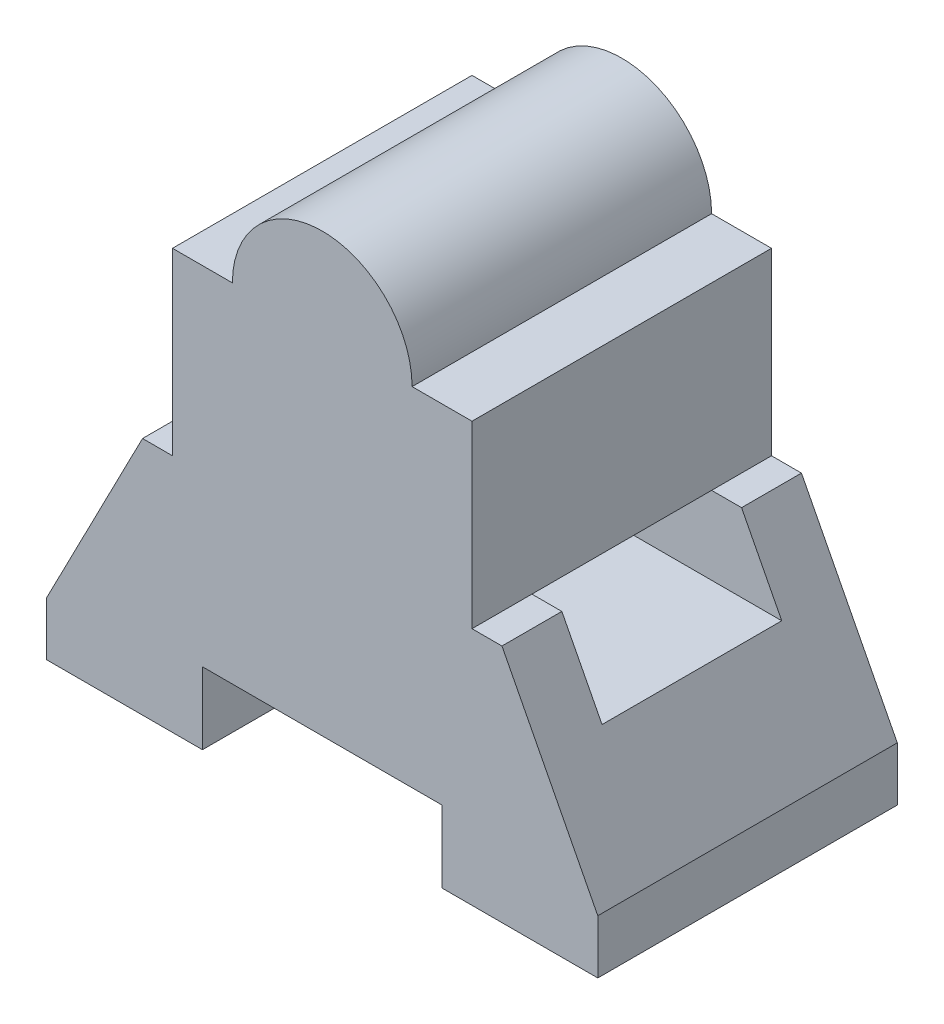
ISO-10303-21;
HEADER;
FILE_DESCRIPTION(('STEP AP214'),'2;1');
FILE_NAME('part.step','',(''),(''),'','','');
FILE_SCHEMA(('AUTOMOTIVE_DESIGN { 1 0 10303 214 1 1 1 1 }'));
ENDSEC;
DATA;
#1=APPLICATION_CONTEXT('core data for automotive mechanical design processes');
#2=APPLICATION_PROTOCOL_DEFINITION('international standard','automotive_design',2000,#1);
#3=PRODUCT_CONTEXT('',#1,'mechanical');
#4=PRODUCT('Part','Part','',(#3));
#5=PRODUCT_RELATED_PRODUCT_CATEGORY('part','',(#4));
#6=PRODUCT_DEFINITION_FORMATION('','',#4);
#7=PRODUCT_DEFINITION_CONTEXT('part definition',#1,'design');
#8=PRODUCT_DEFINITION('design','',#6,#7);
#9=PRODUCT_DEFINITION_SHAPE('','',#8);
#10=(LENGTH_UNIT() NAMED_UNIT(*) SI_UNIT(.MILLI.,.METRE.));
#11=(NAMED_UNIT(*) PLANE_ANGLE_UNIT() SI_UNIT($,.RADIAN.));
#12=(NAMED_UNIT(*) SI_UNIT($,.STERADIAN.) SOLID_ANGLE_UNIT());
#13=UNCERTAINTY_MEASURE_WITH_UNIT(LENGTH_MEASURE(1.E-05),#10,'distance_accuracy_value','');
#14=(GEOMETRIC_REPRESENTATION_CONTEXT(3) GLOBAL_UNCERTAINTY_ASSIGNED_CONTEXT((#13)) GLOBAL_UNIT_ASSIGNED_CONTEXT((#10,
#11,#12)) REPRESENTATION_CONTEXT('',''));
#15=CARTESIAN_POINT('',(0.,0.,0.));
#16=DIRECTION('',(0.,0.,1.));
#17=DIRECTION('',(1.,0.,0.));
#18=AXIS2_PLACEMENT_3D('',#15,#16,#17);
#19=CARTESIAN_POINT('',(21.,40.,50.));
#20=DIRECTION('',(0.,-1.,0.));
#21=DIRECTION('',(0.,0.,-1.));
#22=AXIS2_PLACEMENT_3D('',#19,#20,#21);
#23=PLANE('',#22);
#24=DIRECTION('',(0.,0.,-1.));
#25=VECTOR('',#24,1.);
#26=CARTESIAN_POINT('',(21.,40.,50.));
#27=LINE('',#26,#25);
#28=CARTESIAN_POINT('',(21.,40.,50.));
#29=VERTEX_POINT('',#28);
#30=CARTESIAN_POINT('',(21.,40.,40.));
#31=VERTEX_POINT('',#30);
#32=EDGE_CURVE('E270',#29,#31,#27,.T.);
#33=ORIENTED_EDGE('',*,*,#32,.T.);
#34=DIRECTION('',(-1.,0.,0.));
#35=VECTOR('',#34,1.);
#36=CARTESIAN_POINT('',(92.,40.,40.));
#37=LINE('',#36,#35);
#38=CARTESIAN_POINT('',(16.,40.,40.));
#39=VERTEX_POINT('',#38);
#40=EDGE_CURVE('E209',#31,#39,#37,.T.);
#41=ORIENTED_EDGE('',*,*,#40,.T.);
#42=DIRECTION('',(0.,0.,-1.));
#43=VECTOR('',#42,1.);
#44=CARTESIAN_POINT('',(16.,40.,50.));
#45=LINE('',#44,#43);
#46=CARTESIAN_POINT('',(16.,40.,50.));
#47=VERTEX_POINT('',#46);
#48=EDGE_CURVE('E265',#47,#39,#45,.T.);
#49=ORIENTED_EDGE('',*,*,#48,.F.);
#50=DIRECTION('',(-1.,0.,0.));
#51=VECTOR('',#50,1.);
#52=CARTESIAN_POINT('',(21.,40.,50.));
#53=LINE('',#52,#51);
#54=EDGE_CURVE('E417',#29,#47,#53,.T.);
#55=ORIENTED_EDGE('',*,*,#54,.F.);
#56=EDGE_LOOP('',(#33,#41,#49,#55));
#57=FACE_BOUND('',#56,.T.);
#58=ADVANCED_FACE('F44',(#57),#23,.F.);
#59=CARTESIAN_POINT('',(76.,40.,50.));
#60=DIRECTION('',(0.,-1.,0.));
#61=DIRECTION('',(0.,0.,-1.));
#62=AXIS2_PLACEMENT_3D('',#59,#60,#61);
#63=PLANE('',#62);
#64=DIRECTION('',(0.,0.,-1.));
#65=VECTOR('',#64,1.);
#66=CARTESIAN_POINT('',(76.,40.,50.));
#67=LINE('',#66,#65);
#68=CARTESIAN_POINT('',(76.,40.,50.));
#69=VERTEX_POINT('',#68);
#70=CARTESIAN_POINT('',(76.,40.,40.));
#71=VERTEX_POINT('',#70);
#72=EDGE_CURVE('E214',#69,#71,#67,.T.);
#73=ORIENTED_EDGE('',*,*,#72,.T.);
#74=CARTESIAN_POINT('',(71.,40.,40.));
#75=VERTEX_POINT('',#74);
#76=EDGE_CURVE('E194',#71,#75,#37,.T.);
#77=ORIENTED_EDGE('',*,*,#76,.T.);
#78=DIRECTION('',(0.,0.,-1.));
#79=VECTOR('',#78,1.);
#80=CARTESIAN_POINT('',(71.,40.,50.));
#81=LINE('',#80,#79);
#82=CARTESIAN_POINT('',(71.,40.,50.));
#83=VERTEX_POINT('',#82);
#84=EDGE_CURVE('E233',#83,#75,#81,.T.);
#85=ORIENTED_EDGE('',*,*,#84,.F.);
#86=DIRECTION('',(-1.,0.,0.));
#87=VECTOR('',#86,1.);
#88=CARTESIAN_POINT('',(76.,40.,50.));
#89=LINE('',#88,#87);
#90=EDGE_CURVE('E222',#69,#83,#89,.T.);
#91=ORIENTED_EDGE('',*,*,#90,.F.);
#92=EDGE_LOOP('',(#73,#77,#85,#91));
#93=FACE_BOUND('',#92,.T.);
#94=ADVANCED_FACE('F221',(#93),#63,.F.);
#95=CARTESIAN_POINT('',(31.,70.,50.));
#96=DIRECTION('',(0.,-1.,0.));
#97=DIRECTION('',(0.,0.,-1.));
#98=AXIS2_PLACEMENT_3D('',#95,#96,#97);
#99=PLANE('',#98);
#100=DIRECTION('',(-1.,0.,0.));
#101=VECTOR('',#100,1.);
#102=CARTESIAN_POINT('',(31.,70.,0.));
#103=LINE('',#102,#101);
#104=CARTESIAN_POINT('',(31.,70.,0.));
#105=VERTEX_POINT('',#104);
#106=CARTESIAN_POINT('',(21.,70.,0.));
#107=VERTEX_POINT('',#106);
#108=EDGE_CURVE('E291',#105,#107,#103,.T.);
#109=ORIENTED_EDGE('',*,*,#108,.T.);
#110=DIRECTION('',(0.,0.,-1.));
#111=VECTOR('',#110,1.);
#112=CARTESIAN_POINT('',(21.,70.,50.));
#113=LINE('',#112,#111);
#114=CARTESIAN_POINT('',(21.,70.,50.));
#115=VERTEX_POINT('',#114);
#116=EDGE_CURVE('E53',#115,#107,#113,.T.);
#117=ORIENTED_EDGE('',*,*,#116,.F.);
#118=DIRECTION('',(-1.,0.,0.));
#119=VECTOR('',#118,1.);
#120=CARTESIAN_POINT('',(31.,70.,50.));
#121=LINE('',#120,#119);
#122=CARTESIAN_POINT('',(31.,70.,50.));
#123=VERTEX_POINT('',#122);
#124=EDGE_CURVE('E354',#123,#115,#121,.T.);
#125=ORIENTED_EDGE('',*,*,#124,.F.);
#126=DIRECTION('',(0.,0.,-1.));
#127=VECTOR('',#126,1.);
#128=CARTESIAN_POINT('',(31.,70.,50.));
#129=LINE('',#128,#127);
#130=EDGE_CURVE('E293',#123,#105,#129,.T.);
#131=ORIENTED_EDGE('',*,*,#130,.T.);
#132=EDGE_LOOP('',(#109,#117,#125,#131));
#133=FACE_BOUND('',#132,.T.);
#134=ADVANCED_FACE('F46',(#133),#99,.F.);
#135=CARTESIAN_POINT('',(21.,70.,50.));
#136=DIRECTION('',(1.,0.,0.));
#137=DIRECTION('',(0.,1.,0.));
#138=AXIS2_PLACEMENT_3D('',#135,#136,#137);
#139=PLANE('',#138);
#140=DIRECTION('',(0.,-1.,0.));
#141=VECTOR('',#140,1.);
#142=CARTESIAN_POINT('',(21.,70.,0.));
#143=LINE('',#142,#141);
#144=CARTESIAN_POINT('',(21.,40.,0.));
#145=VERTEX_POINT('',#144);
#146=EDGE_CURVE('E282',#107,#145,#143,.T.);
#147=ORIENTED_EDGE('',*,*,#146,.T.);
#148=CARTESIAN_POINT('',(21.,40.,10.));
#149=VERTEX_POINT('',#148);
#150=EDGE_CURVE('E269',#149,#145,#27,.T.);
#151=ORIENTED_EDGE('',*,*,#150,.F.);
#152=DIRECTION('',(0.,0.,1.));
#153=VECTOR('',#152,1.);
#154=CARTESIAN_POINT('',(21.,40.,50.));
#155=LINE('',#154,#153);
#156=EDGE_CURVE('E207',#149,#31,#155,.T.);
#157=ORIENTED_EDGE('',*,*,#156,.T.);
#158=ORIENTED_EDGE('',*,*,#32,.F.);
#159=DIRECTION('',(0.,-1.,0.));
#160=VECTOR('',#159,1.);
#161=CARTESIAN_POINT('',(21.,70.,50.));
#162=LINE('',#161,#160);
#163=EDGE_CURVE('E285',#115,#29,#162,.T.);
#164=ORIENTED_EDGE('',*,*,#163,.F.);
#165=ORIENTED_EDGE('',*,*,#116,.T.);
#166=EDGE_LOOP('',(#147,#151,#157,#158,#164,#165));
#167=FACE_BOUND('',#166,.T.);
#168=ADVANCED_FACE('F280',(#167),#139,.F.);
#169=CARTESIAN_POINT('',(16.,40.,10.));
#170=VERTEX_POINT('',#169);
#171=CARTESIAN_POINT('',(16.,40.,0.));
#172=VERTEX_POINT('',#171);
#173=EDGE_CURVE('E264',#170,#172,#45,.T.);
#174=ORIENTED_EDGE('',*,*,#173,.F.);
#175=DIRECTION('',(-1.,0.,0.));
#176=VECTOR('',#175,1.);
#177=CARTESIAN_POINT('',(92.,40.,10.));
#178=LINE('',#177,#176);
#179=EDGE_CURVE('E60',#149,#170,#178,.T.);
#180=ORIENTED_EDGE('',*,*,#179,.F.);
#181=ORIENTED_EDGE('',*,*,#150,.T.);
#182=DIRECTION('',(-1.,0.,0.));
#183=VECTOR('',#182,1.);
#184=CARTESIAN_POINT('',(21.,40.,0.));
#185=LINE('',#184,#183);
#186=EDGE_CURVE('E302',#145,#172,#185,.T.);
#187=ORIENTED_EDGE('',*,*,#186,.T.);
#188=EDGE_LOOP('',(#174,#180,#181,#187));
#189=FACE_BOUND('',#188,.T.);
#190=ADVANCED_FACE('F583',(#189),#23,.F.);
#191=CARTESIAN_POINT('',(16.,40.,50.));
#192=DIRECTION('',(0.888620657054864,-0.458642919770252,0.));
#193=DIRECTION('',(0.458642919770252,0.888620657054864,0.));
#194=AXIS2_PLACEMENT_3D('',#191,#192,#193);
#195=PLANE('',#194);
#196=ORIENTED_EDGE('',*,*,#48,.T.);
#197=DIRECTION('',(-0.458642919770252,-0.888620657054864,0.));
#198=VECTOR('',#197,1.);
#199=CARTESIAN_POINT('',(16.,40.,40.));
#200=LINE('',#199,#198);
#201=CARTESIAN_POINT('',(9.29032258064516,27.,40.));
#202=VERTEX_POINT('',#201);
#203=EDGE_CURVE('E218',#39,#202,#200,.T.);
#204=ORIENTED_EDGE('',*,*,#203,.T.);
#205=DIRECTION('',(0.,0.,-1.));
#206=VECTOR('',#205,1.);
#207=CARTESIAN_POINT('',(9.29032258064515,27.,50.));
#208=LINE('',#207,#206);
#209=CARTESIAN_POINT('',(9.29032258064516,27.,10.));
#210=VERTEX_POINT('',#209);
#211=EDGE_CURVE('E297',#202,#210,#208,.T.);
#212=ORIENTED_EDGE('',*,*,#211,.T.);
#213=DIRECTION('',(0.458642919770252,0.888620657054864,0.));
#214=VECTOR('',#213,1.);
#215=CARTESIAN_POINT('',(16.,40.,10.));
#216=LINE('',#215,#214);
#217=EDGE_CURVE('E219',#210,#170,#216,.T.);
#218=ORIENTED_EDGE('',*,*,#217,.T.);
#219=ORIENTED_EDGE('',*,*,#173,.T.);
#220=DIRECTION('',(-0.458642919770252,-0.888620657054864,0.));
#221=VECTOR('',#220,1.);
#222=CARTESIAN_POINT('',(16.,40.,0.));
#223=LINE('',#222,#221);
#224=CARTESIAN_POINT('',(0.,9.,0.));
#225=VERTEX_POINT('',#224);
#226=EDGE_CURVE('E313',#172,#225,#223,.T.);
#227=ORIENTED_EDGE('',*,*,#226,.T.);
#228=DIRECTION('',(0.,0.,-1.));
#229=VECTOR('',#228,1.);
#230=CARTESIAN_POINT('',(0.,9.,50.));
#231=LINE('',#230,#229);
#232=CARTESIAN_POINT('',(0.,9.,50.));
#233=VERTEX_POINT('',#232);
#234=EDGE_CURVE('E260',#233,#225,#231,.T.);
#235=ORIENTED_EDGE('',*,*,#234,.F.);
#236=DIRECTION('',(-0.458642919770252,-0.888620657054864,0.));
#237=VECTOR('',#236,1.);
#238=CARTESIAN_POINT('',(16.,40.,50.));
#239=LINE('',#238,#237);
#240=EDGE_CURVE('E414',#47,#233,#239,.T.);
#241=ORIENTED_EDGE('',*,*,#240,.F.);
#242=EDGE_LOOP('',(#196,#204,#212,#218,#219,#227,#235,#241));
#243=FACE_BOUND('',#242,.T.);
#244=ADVANCED_FACE('F617',(#243),#195,.F.);
#245=CARTESIAN_POINT('',(0.,9.,50.));
#246=DIRECTION('',(1.,0.,0.));
#247=DIRECTION('',(0.,1.,0.));
#248=AXIS2_PLACEMENT_3D('',#245,#246,#247);
#249=PLANE('',#248);
#250=DIRECTION('',(0.,-1.,0.));
#251=VECTOR('',#250,1.);
#252=CARTESIAN_POINT('',(0.,9.,0.));
#253=LINE('',#252,#251);
#254=CARTESIAN_POINT('',(0.,0.,0.));
#255=VERTEX_POINT('',#254);
#256=EDGE_CURVE('E316',#225,#255,#253,.T.);
#257=ORIENTED_EDGE('',*,*,#256,.T.);
#258=DIRECTION('',(0.,0.,-1.));
#259=VECTOR('',#258,1.);
#260=CARTESIAN_POINT('',(0.,0.,50.));
#261=LINE('',#260,#259);
#262=CARTESIAN_POINT('',(0.,0.,50.));
#263=VERTEX_POINT('',#262);
#264=EDGE_CURVE('E256',#263,#255,#261,.T.);
#265=ORIENTED_EDGE('',*,*,#264,.F.);
#266=DIRECTION('',(0.,-1.,0.));
#267=VECTOR('',#266,1.);
#268=CARTESIAN_POINT('',(0.,9.,50.));
#269=LINE('',#268,#267);
#270=EDGE_CURVE('E411',#233,#263,#269,.T.);
#271=ORIENTED_EDGE('',*,*,#270,.F.);
#272=ORIENTED_EDGE('',*,*,#234,.T.);
#273=EDGE_LOOP('',(#257,#265,#271,#272));
#274=FACE_BOUND('',#273,.T.);
#275=ADVANCED_FACE('F622',(#274),#249,.F.);
#276=CARTESIAN_POINT('',(0.,0.,50.));
#277=DIRECTION('',(0.,1.,0.));
#278=DIRECTION('',(0.,0.,1.));
#279=AXIS2_PLACEMENT_3D('',#276,#277,#278);
#280=PLANE('',#279);
#281=DIRECTION('',(1.,0.,0.));
#282=VECTOR('',#281,1.);
#283=CARTESIAN_POINT('',(0.,0.,0.));
#284=LINE('',#283,#282);
#285=CARTESIAN_POINT('',(26.,0.,0.));
#286=VERTEX_POINT('',#285);
#287=EDGE_CURVE('E319',#255,#286,#284,.T.);
#288=ORIENTED_EDGE('',*,*,#287,.T.);
#289=DIRECTION('',(0.,0.,-1.));
#290=VECTOR('',#289,1.);
#291=CARTESIAN_POINT('',(26.,0.,50.));
#292=LINE('',#291,#290);
#293=CARTESIAN_POINT('',(26.,0.,50.));
#294=VERTEX_POINT('',#293);
#295=EDGE_CURVE('E252',#294,#286,#292,.T.);
#296=ORIENTED_EDGE('',*,*,#295,.F.);
#297=DIRECTION('',(1.,0.,0.));
#298=VECTOR('',#297,1.);
#299=CARTESIAN_POINT('',(0.,0.,50.));
#300=LINE('',#299,#298);
#301=EDGE_CURVE('E408',#263,#294,#300,.T.);
#302=ORIENTED_EDGE('',*,*,#301,.F.);
#303=ORIENTED_EDGE('',*,*,#264,.T.);
#304=EDGE_LOOP('',(#288,#296,#302,#303));
#305=FACE_BOUND('',#304,.T.);
#306=ADVANCED_FACE('F818',(#305),#280,.F.);
#307=CARTESIAN_POINT('',(26.,0.,50.));
#308=DIRECTION('',(-1.,0.,0.));
#309=DIRECTION('',(0.,0.,1.));
#310=AXIS2_PLACEMENT_3D('',#307,#308,#309);
#311=PLANE('',#310);
#312=DIRECTION('',(0.,1.,0.));
#313=VECTOR('',#312,1.);
#314=CARTESIAN_POINT('',(26.,0.,0.));
#315=LINE('',#314,#313);
#316=CARTESIAN_POINT('',(26.,12.,0.));
#317=VERTEX_POINT('',#316);
#318=EDGE_CURVE('E322',#286,#317,#315,.T.);
#319=ORIENTED_EDGE('',*,*,#318,.T.);
#320=DIRECTION('',(0.,0.,-1.));
#321=VECTOR('',#320,1.);
#322=CARTESIAN_POINT('',(26.,12.,50.));
#323=LINE('',#322,#321);
#324=CARTESIAN_POINT('',(26.,12.,50.));
#325=VERTEX_POINT('',#324);
#326=EDGE_CURVE('E248',#325,#317,#323,.T.);
#327=ORIENTED_EDGE('',*,*,#326,.F.);
#328=DIRECTION('',(0.,1.,0.));
#329=VECTOR('',#328,1.);
#330=CARTESIAN_POINT('',(26.,0.,50.));
#331=LINE('',#330,#329);
#332=EDGE_CURVE('E405',#294,#325,#331,.T.);
#333=ORIENTED_EDGE('',*,*,#332,.F.);
#334=ORIENTED_EDGE('',*,*,#295,.T.);
#335=EDGE_LOOP('',(#319,#327,#333,#334));
#336=FACE_BOUND('',#335,.T.);
#337=ADVANCED_FACE('F807',(#336),#311,.F.);
#338=CARTESIAN_POINT('',(26.,12.,50.));
#339=DIRECTION('',(0.,1.,0.));
#340=DIRECTION('',(0.,0.,1.));
#341=AXIS2_PLACEMENT_3D('',#338,#339,#340);
#342=PLANE('',#341);
#343=DIRECTION('',(1.,0.,0.));
#344=VECTOR('',#343,1.);
#345=CARTESIAN_POINT('',(26.,12.,0.));
#346=LINE('',#345,#344);
#347=CARTESIAN_POINT('',(66.,12.,0.));
#348=VERTEX_POINT('',#347);
#349=EDGE_CURVE('E325',#317,#348,#346,.T.);
#350=ORIENTED_EDGE('',*,*,#349,.T.);
#351=DIRECTION('',(0.,0.,-1.));
#352=VECTOR('',#351,1.);
#353=CARTESIAN_POINT('',(66.,12.,50.));
#354=LINE('',#353,#352);
#355=CARTESIAN_POINT('',(66.,12.,50.));
#356=VERTEX_POINT('',#355);
#357=EDGE_CURVE('E244',#356,#348,#354,.T.);
#358=ORIENTED_EDGE('',*,*,#357,.F.);
#359=DIRECTION('',(1.,0.,0.));
#360=VECTOR('',#359,1.);
#361=CARTESIAN_POINT('',(26.,12.,50.));
#362=LINE('',#361,#360);
#363=EDGE_CURVE('E402',#325,#356,#362,.T.);
#364=ORIENTED_EDGE('',*,*,#363,.F.);
#365=ORIENTED_EDGE('',*,*,#326,.T.);
#366=EDGE_LOOP('',(#350,#358,#364,#365));
#367=FACE_BOUND('',#366,.T.);
#368=ADVANCED_FACE('F796',(#367),#342,.F.);
#369=CARTESIAN_POINT('',(66.,12.,50.));
#370=DIRECTION('',(1.,0.,0.));
#371=DIRECTION('',(0.,0.,-1.));
#372=AXIS2_PLACEMENT_3D('',#369,#370,#371);
#373=PLANE('',#372);
#374=DIRECTION('',(0.,-1.,0.));
#375=VECTOR('',#374,1.);
#376=CARTESIAN_POINT('',(66.,12.,0.));
#377=LINE('',#376,#375);
#378=CARTESIAN_POINT('',(66.,0.,0.));
#379=VERTEX_POINT('',#378);
#380=EDGE_CURVE('E328',#348,#379,#377,.T.);
#381=ORIENTED_EDGE('',*,*,#380,.T.);
#382=DIRECTION('',(0.,0.,-1.));
#383=VECTOR('',#382,1.);
#384=CARTESIAN_POINT('',(66.,0.,50.));
#385=LINE('',#384,#383);
#386=CARTESIAN_POINT('',(66.,0.,50.));
#387=VERTEX_POINT('',#386);
#388=EDGE_CURVE('E240',#387,#379,#385,.T.);
#389=ORIENTED_EDGE('',*,*,#388,.F.);
#390=DIRECTION('',(0.,-1.,0.));
#391=VECTOR('',#390,1.);
#392=CARTESIAN_POINT('',(66.,12.,50.));
#393=LINE('',#392,#391);
#394=EDGE_CURVE('E399',#356,#387,#393,.T.);
#395=ORIENTED_EDGE('',*,*,#394,.F.);
#396=ORIENTED_EDGE('',*,*,#357,.T.);
#397=EDGE_LOOP('',(#381,#389,#395,#396));
#398=FACE_BOUND('',#397,.T.);
#399=ADVANCED_FACE('F785',(#398),#373,.F.);
#400=CARTESIAN_POINT('',(66.,0.,50.));
#401=DIRECTION('',(0.,1.,0.));
#402=DIRECTION('',(0.,0.,1.));
#403=AXIS2_PLACEMENT_3D('',#400,#401,#402);
#404=PLANE('',#403);
#405=DIRECTION('',(1.,0.,0.));
#406=VECTOR('',#405,1.);
#407=CARTESIAN_POINT('',(66.,0.,0.));
#408=LINE('',#407,#406);
#409=CARTESIAN_POINT('',(92.,0.,0.));
#410=VERTEX_POINT('',#409);
#411=EDGE_CURVE('E331',#379,#410,#408,.T.);
#412=ORIENTED_EDGE('',*,*,#411,.T.);
#413=DIRECTION('',(0.,0.,-1.));
#414=VECTOR('',#413,1.);
#415=CARTESIAN_POINT('',(92.,0.,50.));
#416=LINE('',#415,#414);
#417=CARTESIAN_POINT('',(92.,0.,50.));
#418=VERTEX_POINT('',#417);
#419=EDGE_CURVE('E231',#418,#410,#416,.T.);
#420=ORIENTED_EDGE('',*,*,#419,.F.);
#421=DIRECTION('',(1.,0.,0.));
#422=VECTOR('',#421,1.);
#423=CARTESIAN_POINT('',(66.,0.,50.));
#424=LINE('',#423,#422);
#425=EDGE_CURVE('E396',#387,#418,#424,.T.);
#426=ORIENTED_EDGE('',*,*,#425,.F.);
#427=ORIENTED_EDGE('',*,*,#388,.T.);
#428=EDGE_LOOP('',(#412,#420,#426,#427));
#429=FACE_BOUND('',#428,.T.);
#430=ADVANCED_FACE('F774',(#429),#404,.F.);
#431=CARTESIAN_POINT('',(92.,0.,50.));
#432=DIRECTION('',(-1.,0.,0.));
#433=DIRECTION('',(0.,0.,1.));
#434=AXIS2_PLACEMENT_3D('',#431,#432,#433);
#435=PLANE('',#434);
#436=DIRECTION('',(0.,1.,0.));
#437=VECTOR('',#436,1.);
#438=CARTESIAN_POINT('',(92.,0.,0.));
#439=LINE('',#438,#437);
#440=CARTESIAN_POINT('',(92.,9.,0.));
#441=VERTEX_POINT('',#440);
#442=EDGE_CURVE('E334',#410,#441,#439,.T.);
#443=ORIENTED_EDGE('',*,*,#442,.T.);
#444=DIRECTION('',(0.,0.,-1.));
#445=VECTOR('',#444,1.);
#446=CARTESIAN_POINT('',(92.,9.,50.));
#447=LINE('',#446,#445);
#448=CARTESIAN_POINT('',(92.,9.,50.));
#449=VERTEX_POINT('',#448);
#450=EDGE_CURVE('E224',#449,#441,#447,.T.);
#451=ORIENTED_EDGE('',*,*,#450,.F.);
#452=DIRECTION('',(0.,1.,0.));
#453=VECTOR('',#452,1.);
#454=CARTESIAN_POINT('',(92.,0.,50.));
#455=LINE('',#454,#453);
#456=EDGE_CURVE('E393',#418,#449,#455,.T.);
#457=ORIENTED_EDGE('',*,*,#456,.F.);
#458=ORIENTED_EDGE('',*,*,#419,.T.);
#459=EDGE_LOOP('',(#443,#451,#457,#458));
#460=FACE_BOUND('',#459,.T.);
#461=ADVANCED_FACE('F666',(#460),#435,.F.);
#462=CARTESIAN_POINT('',(92.,9.,50.));
#463=DIRECTION('',(-0.888620657054864,-0.458642919770252,0.));
#464=DIRECTION('',(0.458642919770252,-0.888620657054864,0.));
#465=AXIS2_PLACEMENT_3D('',#462,#463,#464);
#466=PLANE('',#465);
#467=DIRECTION('',(0.,0.,1.));
#468=VECTOR('',#467,1.);
#469=CARTESIAN_POINT('',(82.7096774193548,27.,50.));
#470=LINE('',#469,#468);
#471=CARTESIAN_POINT('',(82.7096774193548,27.,10.));
#472=VERTEX_POINT('',#471);
#473=CARTESIAN_POINT('',(82.7096774193548,27.,40.));
#474=VERTEX_POINT('',#473);
#475=EDGE_CURVE('E11',#472,#474,#470,.T.);
#476=ORIENTED_EDGE('',*,*,#475,.T.);
#477=DIRECTION('',(-0.458642919770252,0.888620657054864,0.));
#478=VECTOR('',#477,1.);
#479=CARTESIAN_POINT('',(92.,9.,40.));
#480=LINE('',#479,#478);
#481=EDGE_CURVE('E198',#474,#71,#480,.T.);
#482=ORIENTED_EDGE('',*,*,#481,.T.);
#483=ORIENTED_EDGE('',*,*,#72,.F.);
#484=DIRECTION('',(-0.458642919770252,0.888620657054864,0.));
#485=VECTOR('',#484,1.);
#486=CARTESIAN_POINT('',(92.,9.,50.));
#487=LINE('',#486,#485);
#488=EDGE_CURVE('E388',#449,#69,#487,.T.);
#489=ORIENTED_EDGE('',*,*,#488,.F.);
#490=ORIENTED_EDGE('',*,*,#450,.T.);
#491=DIRECTION('',(-0.458642919770252,0.888620657054864,0.));
#492=VECTOR('',#491,1.);
#493=CARTESIAN_POINT('',(92.,9.,0.));
#494=LINE('',#493,#492);
#495=CARTESIAN_POINT('',(76.,40.,0.));
#496=VERTEX_POINT('',#495);
#497=EDGE_CURVE('E337',#441,#496,#494,.T.);
#498=ORIENTED_EDGE('',*,*,#497,.T.);
#499=CARTESIAN_POINT('',(76.,40.,10.));
#500=VERTEX_POINT('',#499);
#501=EDGE_CURVE('E225',#500,#496,#67,.T.);
#502=ORIENTED_EDGE('',*,*,#501,.F.);
#503=DIRECTION('',(0.458642919770252,-0.888620657054864,0.));
#504=VECTOR('',#503,1.);
#505=CARTESIAN_POINT('',(92.,9.00000000000001,10.));
#506=LINE('',#505,#504);
#507=EDGE_CURVE('E429',#500,#472,#506,.T.);
#508=ORIENTED_EDGE('',*,*,#507,.T.);
#509=EDGE_LOOP('',(#476,#482,#483,#489,#490,#498,#502,#508));
#510=FACE_BOUND('',#509,.T.);
#511=ADVANCED_FACE('F212',(#510),#466,.F.);
#512=CARTESIAN_POINT('',(71.,40.,10.));
#513=VERTEX_POINT('',#512);
#514=CARTESIAN_POINT('',(71.,40.,0.));
#515=VERTEX_POINT('',#514);
#516=EDGE_CURVE('E363',#513,#515,#81,.T.);
#517=ORIENTED_EDGE('',*,*,#516,.F.);
#518=EDGE_CURVE('E66',#500,#513,#178,.T.);
#519=ORIENTED_EDGE('',*,*,#518,.F.);
#520=ORIENTED_EDGE('',*,*,#501,.T.);
#521=DIRECTION('',(-1.,0.,0.));
#522=VECTOR('',#521,1.);
#523=CARTESIAN_POINT('',(76.,40.,0.));
#524=LINE('',#523,#522);
#525=EDGE_CURVE('E341',#496,#515,#524,.T.);
#526=ORIENTED_EDGE('',*,*,#525,.T.);
#527=EDGE_LOOP('',(#517,#519,#520,#526));
#528=FACE_BOUND('',#527,.T.);
#529=ADVANCED_FACE('F607',(#528),#63,.F.);
#530=CARTESIAN_POINT('',(71.,40.,50.));
#531=DIRECTION('',(-1.,0.,0.));
#532=DIRECTION('',(0.,0.,1.));
#533=AXIS2_PLACEMENT_3D('',#530,#531,#532);
#534=PLANE('',#533);
#535=DIRECTION('',(0.,1.,0.));
#536=VECTOR('',#535,1.);
#537=CARTESIAN_POINT('',(71.,40.,0.));
#538=LINE('',#537,#536);
#539=CARTESIAN_POINT('',(71.,70.,0.));
#540=VERTEX_POINT('',#539);
#541=EDGE_CURVE('E345',#515,#540,#538,.T.);
#542=ORIENTED_EDGE('',*,*,#541,.T.);
#543=DIRECTION('',(0.,0.,-1.));
#544=VECTOR('',#543,1.);
#545=CARTESIAN_POINT('',(71.,70.,50.));
#546=LINE('',#545,#544);
#547=CARTESIAN_POINT('',(71.,70.,50.));
#548=VERTEX_POINT('',#547);
#549=EDGE_CURVE('E360',#548,#540,#546,.T.);
#550=ORIENTED_EDGE('',*,*,#549,.F.);
#551=DIRECTION('',(0.,1.,0.));
#552=VECTOR('',#551,1.);
#553=CARTESIAN_POINT('',(71.,40.,50.));
#554=LINE('',#553,#552);
#555=EDGE_CURVE('E380',#83,#548,#554,.T.);
#556=ORIENTED_EDGE('',*,*,#555,.F.);
#557=ORIENTED_EDGE('',*,*,#84,.T.);
#558=EDGE_CURVE('E370',#75,#513,#81,.T.);
#559=ORIENTED_EDGE('',*,*,#558,.T.);
#560=ORIENTED_EDGE('',*,*,#516,.T.);
#561=EDGE_LOOP('',(#542,#550,#556,#557,#559,#560));
#562=FACE_BOUND('',#561,.T.);
#563=ADVANCED_FACE('F379',(#562),#534,.F.);
#564=CARTESIAN_POINT('',(71.,70.,50.));
#565=DIRECTION('',(0.,-1.,0.));
#566=DIRECTION('',(0.,0.,-1.));
#567=AXIS2_PLACEMENT_3D('',#564,#565,#566);
#568=PLANE('',#567);
#569=DIRECTION('',(-1.,0.,0.));
#570=VECTOR('',#569,1.);
#571=CARTESIAN_POINT('',(71.,70.,0.));
#572=LINE('',#571,#570);
#573=CARTESIAN_POINT('',(61.,70.,0.));
#574=VERTEX_POINT('',#573);
#575=EDGE_CURVE('E348',#540,#574,#572,.T.);
#576=ORIENTED_EDGE('',*,*,#575,.T.);
#577=DIRECTION('',(0.,0.,-1.));
#578=VECTOR('',#577,1.);
#579=CARTESIAN_POINT('',(61.,70.,50.));
#580=LINE('',#579,#578);
#581=CARTESIAN_POINT('',(61.,70.,50.));
#582=VERTEX_POINT('',#581);
#583=EDGE_CURVE('E357',#582,#574,#580,.T.);
#584=ORIENTED_EDGE('',*,*,#583,.F.);
#585=DIRECTION('',(-1.,0.,0.));
#586=VECTOR('',#585,1.);
#587=CARTESIAN_POINT('',(71.,70.,50.));
#588=LINE('',#587,#586);
#589=EDGE_CURVE('E383',#548,#582,#588,.T.);
#590=ORIENTED_EDGE('',*,*,#589,.F.);
#591=ORIENTED_EDGE('',*,*,#549,.T.);
#592=EDGE_LOOP('',(#576,#584,#590,#591));
#593=FACE_BOUND('',#592,.T.);
#594=ADVANCED_FACE('F599',(#593),#568,.F.);
#595=CARTESIAN_POINT('',(46.,70.,50.));
#596=DIRECTION('',(0.,0.,-1.));
#597=DIRECTION('',(-1.,0.,0.));
#598=AXIS2_PLACEMENT_3D('',#595,#596,#597);
#599=CYLINDRICAL_SURFACE('',#598,15.);
#600=CARTESIAN_POINT('',(46.,70.,0.));
#601=DIRECTION('',(0.,0.,1.));
#602=DIRECTION('',(1.,0.,0.));
#603=AXIS2_PLACEMENT_3D('',#600,#601,#602);
#604=CIRCLE('',#603,15.);
#605=EDGE_CURVE('E351',#574,#105,#604,.T.);
#606=ORIENTED_EDGE('',*,*,#605,.T.);
#607=ORIENTED_EDGE('',*,*,#130,.F.);
#608=CARTESIAN_POINT('',(46.,70.,50.));
#609=DIRECTION('',(0.,0.,1.));
#610=DIRECTION('',(1.,0.,0.));
#611=AXIS2_PLACEMENT_3D('',#608,#609,#610);
#612=CIRCLE('',#611,15.);
#613=EDGE_CURVE('E307',#582,#123,#612,.T.);
#614=ORIENTED_EDGE('',*,*,#613,.F.);
#615=ORIENTED_EDGE('',*,*,#583,.T.);
#616=EDGE_LOOP('',(#606,#607,#614,#615));
#617=FACE_BOUND('',#616,.T.);
#618=ADVANCED_FACE('F595',(#617),#599,.T.);
#619=CARTESIAN_POINT('',(46.,70.,50.));
#620=DIRECTION('',(0.,0.,1.));
#621=DIRECTION('',(1.,0.,0.));
#622=AXIS2_PLACEMENT_3D('',#619,#620,#621);
#623=PLANE('',#622);
#624=ORIENTED_EDGE('',*,*,#124,.T.);
#625=ORIENTED_EDGE('',*,*,#163,.T.);
#626=ORIENTED_EDGE('',*,*,#54,.T.);
#627=ORIENTED_EDGE('',*,*,#240,.T.);
#628=ORIENTED_EDGE('',*,*,#270,.T.);
#629=ORIENTED_EDGE('',*,*,#301,.T.);
#630=ORIENTED_EDGE('',*,*,#332,.T.);
#631=ORIENTED_EDGE('',*,*,#363,.T.);
#632=ORIENTED_EDGE('',*,*,#394,.T.);
#633=ORIENTED_EDGE('',*,*,#425,.T.);
#634=ORIENTED_EDGE('',*,*,#456,.T.);
#635=ORIENTED_EDGE('',*,*,#488,.T.);
#636=ORIENTED_EDGE('',*,*,#90,.T.);
#637=ORIENTED_EDGE('',*,*,#555,.T.);
#638=ORIENTED_EDGE('',*,*,#589,.T.);
#639=ORIENTED_EDGE('',*,*,#613,.T.);
#640=EDGE_LOOP('',(#624,#625,#626,#627,#628,#629,#630,#631,#632,#633,#634,#635,#636,#637,#638,#639));
#641=FACE_BOUND('',#640,.T.);
#642=ADVANCED_FACE('F590',(#641),#623,.T.);
#643=CARTESIAN_POINT('',(46.,70.,0.));
#644=DIRECTION('',(0.,0.,1.));
#645=DIRECTION('',(1.,0.,0.));
#646=AXIS2_PLACEMENT_3D('',#643,#644,#645);
#647=PLANE('',#646);
#648=ORIENTED_EDGE('',*,*,#108,.F.);
#649=ORIENTED_EDGE('',*,*,#605,.F.);
#650=ORIENTED_EDGE('',*,*,#575,.F.);
#651=ORIENTED_EDGE('',*,*,#541,.F.);
#652=ORIENTED_EDGE('',*,*,#525,.F.);
#653=ORIENTED_EDGE('',*,*,#497,.F.);
#654=ORIENTED_EDGE('',*,*,#442,.F.);
#655=ORIENTED_EDGE('',*,*,#411,.F.);
#656=ORIENTED_EDGE('',*,*,#380,.F.);
#657=ORIENTED_EDGE('',*,*,#349,.F.);
#658=ORIENTED_EDGE('',*,*,#318,.F.);
#659=ORIENTED_EDGE('',*,*,#287,.F.);
#660=ORIENTED_EDGE('',*,*,#256,.F.);
#661=ORIENTED_EDGE('',*,*,#226,.F.);
#662=ORIENTED_EDGE('',*,*,#186,.F.);
#663=ORIENTED_EDGE('',*,*,#146,.F.);
#664=EDGE_LOOP('',(#648,#649,#650,#651,#652,#653,#654,#655,#656,#657,#658,#659,#660,#661,#662,#663));
#665=FACE_BOUND('',#664,.T.);
#666=ADVANCED_FACE('F596',(#665),#647,.F.);
#667=CARTESIAN_POINT('',(92.,27.,0.));
#668=DIRECTION('',(0.,-1.,0.));
#669=DIRECTION('',(0.,0.,-1.));
#670=AXIS2_PLACEMENT_3D('',#667,#668,#669);
#671=PLANE('',#670);
#672=DIRECTION('',(-1.,0.,0.));
#673=VECTOR('',#672,1.);
#674=CARTESIAN_POINT('',(92.,27.,40.));
#675=LINE('',#674,#673);
#676=EDGE_CURVE('E437',#474,#202,#675,.T.);
#677=ORIENTED_EDGE('',*,*,#676,.F.);
#678=ORIENTED_EDGE('',*,*,#475,.F.);
#679=DIRECTION('',(-1.,0.,0.));
#680=VECTOR('',#679,1.);
#681=CARTESIAN_POINT('',(92.,27.,10.));
#682=LINE('',#681,#680);
#683=EDGE_CURVE('E440',#472,#210,#682,.T.);
#684=ORIENTED_EDGE('',*,*,#683,.T.);
#685=ORIENTED_EDGE('',*,*,#211,.F.);
#686=EDGE_LOOP('',(#677,#678,#684,#685));
#687=FACE_BOUND('',#686,.T.);
#688=ADVANCED_FACE('F691',(#687),#671,.F.);
#689=CARTESIAN_POINT('',(92.,0.,40.));
#690=DIRECTION('',(0.,0.,1.));
#691=DIRECTION('',(0.,-1.,0.));
#692=AXIS2_PLACEMENT_3D('',#689,#690,#691);
#693=PLANE('',#692);
#694=ORIENTED_EDGE('',*,*,#40,.F.);
#695=EDGE_CURVE('E201',#75,#31,#37,.T.);
#696=ORIENTED_EDGE('',*,*,#695,.F.);
#697=ORIENTED_EDGE('',*,*,#76,.F.);
#698=ORIENTED_EDGE('',*,*,#481,.F.);
#699=ORIENTED_EDGE('',*,*,#676,.T.);
#700=ORIENTED_EDGE('',*,*,#203,.F.);
#701=EDGE_LOOP('',(#694,#696,#697,#698,#699,#700));
#702=FACE_BOUND('',#701,.T.);
#703=ADVANCED_FACE('F196',(#702),#693,.F.);
#704=CARTESIAN_POINT('',(92.,0.,9.99999999999999));
#705=DIRECTION('',(0.,0.,-1.));
#706=DIRECTION('',(0.,1.,0.));
#707=AXIS2_PLACEMENT_3D('',#704,#705,#706);
#708=PLANE('',#707);
#709=ORIENTED_EDGE('',*,*,#683,.F.);
#710=ORIENTED_EDGE('',*,*,#507,.F.);
#711=ORIENTED_EDGE('',*,*,#518,.T.);
#712=EDGE_CURVE('E445',#513,#149,#178,.T.);
#713=ORIENTED_EDGE('',*,*,#712,.T.);
#714=ORIENTED_EDGE('',*,*,#179,.T.);
#715=ORIENTED_EDGE('',*,*,#217,.F.);
#716=EDGE_LOOP('',(#709,#710,#711,#713,#714,#715));
#717=FACE_BOUND('',#716,.T.);
#718=ADVANCED_FACE('F708',(#717),#708,.F.);
#719=CARTESIAN_POINT('',(92.,40.,0.));
#720=DIRECTION('',(0.,1.,0.));
#721=DIRECTION('',(0.,0.,1.));
#722=AXIS2_PLACEMENT_3D('',#719,#720,#721);
#723=PLANE('',#722);
#724=ORIENTED_EDGE('',*,*,#712,.F.);
#725=ORIENTED_EDGE('',*,*,#558,.F.);
#726=ORIENTED_EDGE('',*,*,#695,.T.);
#727=ORIENTED_EDGE('',*,*,#156,.F.);
#728=EDGE_LOOP('',(#724,#725,#726,#727));
#729=FACE_BOUND('',#728,.T.);
#730=ADVANCED_FACE('F718',(#729),#723,.F.);
#731=CLOSED_SHELL('',(#58,#94,#134,#168,#190,#244,#275,#306,#337,#368,#399,#430,#461,#511,#529,
#563,#594,#618,#642,#666,#688,#703,#718,#730));
#732=MANIFOLD_SOLID_BREP('B2',#731);
#733=ADVANCED_BREP_SHAPE_REPRESENTATION('',(#18,#732),#14);
#734=SHAPE_DEFINITION_REPRESENTATION(#9,#733);
ENDSEC;
END-ISO-10303-21;
